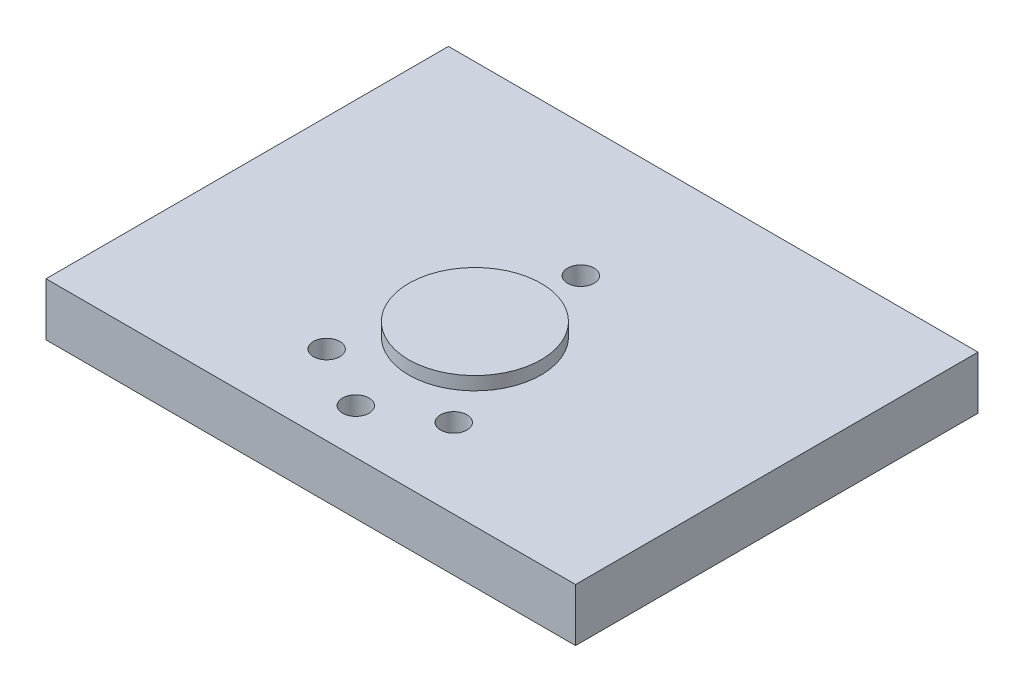
ISO-10303-21;
HEADER;
FILE_DESCRIPTION(('STEP AP214'),'2;1');
FILE_NAME('part.step','',(''),(''),'','','');
FILE_SCHEMA(('AUTOMOTIVE_DESIGN { 1 0 10303 214 1 1 1 1 }'));
ENDSEC;
DATA;
#1=APPLICATION_CONTEXT('core data for automotive mechanical design processes');
#2=APPLICATION_PROTOCOL_DEFINITION('international standard','automotive_design',2000,#1);
#3=PRODUCT_CONTEXT('',#1,'mechanical');
#4=PRODUCT('Part','Part','',(#3));
#5=PRODUCT_RELATED_PRODUCT_CATEGORY('part','',(#4));
#6=PRODUCT_DEFINITION_FORMATION('','',#4);
#7=PRODUCT_DEFINITION_CONTEXT('part definition',#1,'design');
#8=PRODUCT_DEFINITION('design','',#6,#7);
#9=PRODUCT_DEFINITION_SHAPE('','',#8);
#10=(LENGTH_UNIT() NAMED_UNIT(*) SI_UNIT(.MILLI.,.METRE.));
#11=(NAMED_UNIT(*) PLANE_ANGLE_UNIT() SI_UNIT($,.RADIAN.));
#12=(NAMED_UNIT(*) SI_UNIT($,.STERADIAN.) SOLID_ANGLE_UNIT());
#13=UNCERTAINTY_MEASURE_WITH_UNIT(LENGTH_MEASURE(1.E-05),#10,'distance_accuracy_value','');
#14=(GEOMETRIC_REPRESENTATION_CONTEXT(3) GLOBAL_UNCERTAINTY_ASSIGNED_CONTEXT((#13)) GLOBAL_UNIT_ASSIGNED_CONTEXT((#10,
#11,#12)) REPRESENTATION_CONTEXT('',''));
#15=CARTESIAN_POINT('',(0.,0.,0.));
#16=DIRECTION('',(0.,0.,1.));
#17=DIRECTION('',(1.,0.,0.));
#18=AXIS2_PLACEMENT_3D('',#15,#16,#17);
#19=CARTESIAN_POINT('',(63.5,15.875,-48.26));
#20=DIRECTION('',(-1.,0.,0.));
#21=DIRECTION('',(0.,0.,1.));
#22=AXIS2_PLACEMENT_3D('',#19,#20,#21);
#23=PLANE('',#22);
#24=DIRECTION('',(0.,0.,-1.));
#25=VECTOR('',#24,1.);
#26=CARTESIAN_POINT('',(63.5,12.7,48.26));
#27=LINE('',#26,#25);
#28=CARTESIAN_POINT('',(63.5,12.7,48.26));
#29=VERTEX_POINT('',#28);
#30=CARTESIAN_POINT('',(63.5,12.7,-48.26));
#31=VERTEX_POINT('',#30);
#32=EDGE_CURVE('E73',#29,#31,#27,.T.);
#33=ORIENTED_EDGE('',*,*,#32,.F.);
#34=DIRECTION('',(0.,-1.,0.));
#35=VECTOR('',#34,1.);
#36=CARTESIAN_POINT('',(63.5,15.875,48.26));
#37=LINE('',#36,#35);
#38=CARTESIAN_POINT('',(63.5,0.,48.26));
#39=VERTEX_POINT('',#38);
#40=EDGE_CURVE('E55',#29,#39,#37,.T.);
#41=ORIENTED_EDGE('',*,*,#40,.T.);
#42=DIRECTION('',(0.,0.,-1.));
#43=VECTOR('',#42,1.);
#44=CARTESIAN_POINT('',(63.5,0.,-48.26));
#45=LINE('',#44,#43);
#46=CARTESIAN_POINT('',(63.5,0.,-48.26));
#47=VERTEX_POINT('',#46);
#48=EDGE_CURVE('E103',#39,#47,#45,.T.);
#49=ORIENTED_EDGE('',*,*,#48,.T.);
#50=DIRECTION('',(0.,-1.,0.));
#51=VECTOR('',#50,1.);
#52=CARTESIAN_POINT('',(63.5,15.875,-48.26));
#53=LINE('',#52,#51);
#54=EDGE_CURVE('E11',#31,#47,#53,.T.);
#55=ORIENTED_EDGE('',*,*,#54,.F.);
#56=EDGE_LOOP('',(#33,#41,#49,#55));
#57=FACE_BOUND('',#56,.T.);
#58=ADVANCED_FACE('F33',(#57),#23,.F.);
#59=CARTESIAN_POINT('',(-63.5,15.875,-48.26));
#60=DIRECTION('',(0.,0.,1.));
#61=DIRECTION('',(1.,0.,0.));
#62=AXIS2_PLACEMENT_3D('',#59,#60,#61);
#63=PLANE('',#62);
#64=DIRECTION('',(-1.,0.,0.));
#65=VECTOR('',#64,1.);
#66=CARTESIAN_POINT('',(63.5,12.7,-48.26));
#67=LINE('',#66,#65);
#68=CARTESIAN_POINT('',(-63.5,12.7,-48.26));
#69=VERTEX_POINT('',#68);
#70=EDGE_CURVE('E80',#31,#69,#67,.T.);
#71=ORIENTED_EDGE('',*,*,#70,.F.);
#72=ORIENTED_EDGE('',*,*,#54,.T.);
#73=DIRECTION('',(-1.,0.,0.));
#74=VECTOR('',#73,1.);
#75=CARTESIAN_POINT('',(-63.5,0.,-48.26));
#76=LINE('',#75,#74);
#77=CARTESIAN_POINT('',(-63.5,0.,-48.26));
#78=VERTEX_POINT('',#77);
#79=EDGE_CURVE('E100',#47,#78,#76,.T.);
#80=ORIENTED_EDGE('',*,*,#79,.T.);
#81=DIRECTION('',(0.,-1.,0.));
#82=VECTOR('',#81,1.);
#83=CARTESIAN_POINT('',(-63.5,15.875,-48.26));
#84=LINE('',#83,#82);
#85=EDGE_CURVE('E40',#69,#78,#84,.T.);
#86=ORIENTED_EDGE('',*,*,#85,.F.);
#87=EDGE_LOOP('',(#71,#72,#80,#86));
#88=FACE_BOUND('',#87,.T.);
#89=ADVANCED_FACE('F101',(#88),#63,.F.);
#90=CARTESIAN_POINT('',(-63.5,15.875,-48.26));
#91=DIRECTION('',(1.,0.,0.));
#92=DIRECTION('',(0.,0.,-1.));
#93=AXIS2_PLACEMENT_3D('',#90,#91,#92);
#94=PLANE('',#93);
#95=DIRECTION('',(0.,0.,1.));
#96=VECTOR('',#95,1.);
#97=CARTESIAN_POINT('',(-63.5,12.7,-48.26));
#98=LINE('',#97,#96);
#99=CARTESIAN_POINT('',(-63.5,12.7,48.26));
#100=VERTEX_POINT('',#99);
#101=EDGE_CURVE('E47',#69,#100,#98,.T.);
#102=ORIENTED_EDGE('',*,*,#101,.F.);
#103=ORIENTED_EDGE('',*,*,#85,.T.);
#104=DIRECTION('',(0.,0.,1.));
#105=VECTOR('',#104,1.);
#106=CARTESIAN_POINT('',(-63.5,0.,-48.26));
#107=LINE('',#106,#105);
#108=CARTESIAN_POINT('',(-63.5,0.,48.26));
#109=VERTEX_POINT('',#108);
#110=EDGE_CURVE('E89',#78,#109,#107,.T.);
#111=ORIENTED_EDGE('',*,*,#110,.T.);
#112=DIRECTION('',(0.,-1.,0.));
#113=VECTOR('',#112,1.);
#114=CARTESIAN_POINT('',(-63.5,15.875,48.26));
#115=LINE('',#114,#113);
#116=EDGE_CURVE('E86',#100,#109,#115,.T.);
#117=ORIENTED_EDGE('',*,*,#116,.F.);
#118=EDGE_LOOP('',(#102,#103,#111,#117));
#119=FACE_BOUND('',#118,.T.);
#120=ADVANCED_FACE('F96',(#119),#94,.F.);
#121=CARTESIAN_POINT('',(-63.5,15.875,48.26));
#122=DIRECTION('',(0.,0.,-1.));
#123=DIRECTION('',(-1.,0.,0.));
#124=AXIS2_PLACEMENT_3D('',#121,#122,#123);
#125=PLANE('',#124);
#126=DIRECTION('',(1.,0.,0.));
#127=VECTOR('',#126,1.);
#128=CARTESIAN_POINT('',(-63.5,12.7,48.26));
#129=LINE('',#128,#127);
#130=EDGE_CURVE('E71',#100,#29,#129,.T.);
#131=ORIENTED_EDGE('',*,*,#130,.F.);
#132=ORIENTED_EDGE('',*,*,#116,.T.);
#133=DIRECTION('',(1.,0.,0.));
#134=VECTOR('',#133,1.);
#135=CARTESIAN_POINT('',(-63.5,0.,48.26));
#136=LINE('',#135,#134);
#137=EDGE_CURVE('E84',#109,#39,#136,.T.);
#138=ORIENTED_EDGE('',*,*,#137,.T.);
#139=ORIENTED_EDGE('',*,*,#40,.F.);
#140=EDGE_LOOP('',(#131,#132,#138,#139));
#141=FACE_BOUND('',#140,.T.);
#142=ADVANCED_FACE('F82',(#141),#125,.F.);
#143=CARTESIAN_POINT('',(0.,0.,0.));
#144=DIRECTION('',(0.,1.,0.));
#145=DIRECTION('',(0.,0.,1.));
#146=AXIS2_PLACEMENT_3D('',#143,#144,#145);
#147=PLANE('',#146);
#148=CARTESIAN_POINT('',(15.24,0.,29.21));
#149=DIRECTION('',(0.,1.,0.));
#150=DIRECTION('',(0.,0.,1.));
#151=AXIS2_PLACEMENT_3D('',#148,#149,#150);
#152=CIRCLE('',#151,3.17499999999999);
#153=CARTESIAN_POINT('',(15.24,0.,32.385));
#154=VERTEX_POINT('',#153);
#155=EDGE_CURVE('E133',#154,#154,#152,.T.);
#156=ORIENTED_EDGE('',*,*,#155,.T.);
#157=EDGE_LOOP('',(#156));
#158=FACE_BOUND('',#157,.T.);
#159=CARTESIAN_POINT('',(-2.35922392732846E-13,0.,37.4649999999999));
#160=DIRECTION('',(0.,1.,0.));
#161=DIRECTION('',(0.,0.,1.));
#162=AXIS2_PLACEMENT_3D('',#159,#160,#161);
#163=CIRCLE('',#162,3.17499999999999);
#164=CARTESIAN_POINT('',(-2.35922392732846E-13,0.,40.6399999999999));
#165=VERTEX_POINT('',#164);
#166=EDGE_CURVE('E127',#165,#165,#163,.T.);
#167=ORIENTED_EDGE('',*,*,#166,.T.);
#168=EDGE_LOOP('',(#167));
#169=FACE_BOUND('',#168,.T.);
#170=CARTESIAN_POINT('',(0.,0.,-16.51));
#171=DIRECTION('',(0.,1.,0.));
#172=DIRECTION('',(0.,0.,1.));
#173=AXIS2_PLACEMENT_3D('',#170,#171,#172);
#174=CIRCLE('',#173,3.17499999999999);
#175=CARTESIAN_POINT('',(0.,0.,-13.335));
#176=VERTEX_POINT('',#175);
#177=EDGE_CURVE('E121',#176,#176,#174,.T.);
#178=ORIENTED_EDGE('',*,*,#177,.T.);
#179=EDGE_LOOP('',(#178));
#180=FACE_BOUND('',#179,.T.);
#181=CARTESIAN_POINT('',(-15.24,0.,29.21));
#182=DIRECTION('',(0.,1.,0.));
#183=DIRECTION('',(0.,0.,1.));
#184=AXIS2_PLACEMENT_3D('',#181,#182,#183);
#185=CIRCLE('',#184,3.17499999999999);
#186=CARTESIAN_POINT('',(-15.24,0.,32.385));
#187=VERTEX_POINT('',#186);
#188=EDGE_CURVE('E113',#187,#187,#185,.T.);
#189=ORIENTED_EDGE('',*,*,#188,.T.);
#190=EDGE_LOOP('',(#189));
#191=FACE_BOUND('',#190,.T.);
#192=ORIENTED_EDGE('',*,*,#48,.F.);
#193=ORIENTED_EDGE('',*,*,#137,.F.);
#194=ORIENTED_EDGE('',*,*,#110,.F.);
#195=ORIENTED_EDGE('',*,*,#79,.F.);
#196=EDGE_LOOP('',(#192,#193,#194,#195));
#197=FACE_BOUND('',#196,.T.);
#198=ADVANCED_FACE('F105',(#158,#169,#180,#191,#197),#147,.F.);
#199=CARTESIAN_POINT('',(0.,12.7,0.));
#200=DIRECTION('',(0.,1.,0.));
#201=DIRECTION('',(0.,0.,1.));
#202=AXIS2_PLACEMENT_3D('',#199,#200,#201);
#203=PLANE('',#202);
#204=CARTESIAN_POINT('',(15.24,12.7,29.21));
#205=DIRECTION('',(0.,1.,0.));
#206=DIRECTION('',(0.,0.,1.));
#207=AXIS2_PLACEMENT_3D('',#204,#205,#206);
#208=CIRCLE('',#207,3.17499999999999);
#209=CARTESIAN_POINT('',(15.24,12.7,32.385));
#210=VERTEX_POINT('',#209);
#211=EDGE_CURVE('E136',#210,#210,#208,.T.);
#212=ORIENTED_EDGE('',*,*,#211,.F.);
#213=EDGE_LOOP('',(#212));
#214=FACE_BOUND('',#213,.T.);
#215=CARTESIAN_POINT('',(-2.35922392732846E-13,12.7,37.4649999999999));
#216=DIRECTION('',(0.,1.,0.));
#217=DIRECTION('',(0.,0.,1.));
#218=AXIS2_PLACEMENT_3D('',#215,#216,#217);
#219=CIRCLE('',#218,3.17499999999999);
#220=CARTESIAN_POINT('',(-2.35922392732846E-13,12.7,40.6399999999999));
#221=VERTEX_POINT('',#220);
#222=EDGE_CURVE('E130',#221,#221,#219,.T.);
#223=ORIENTED_EDGE('',*,*,#222,.F.);
#224=EDGE_LOOP('',(#223));
#225=FACE_BOUND('',#224,.T.);
#226=CARTESIAN_POINT('',(0.,12.7,-16.51));
#227=DIRECTION('',(0.,1.,0.));
#228=DIRECTION('',(0.,0.,1.));
#229=AXIS2_PLACEMENT_3D('',#226,#227,#228);
#230=CIRCLE('',#229,3.17499999999999);
#231=CARTESIAN_POINT('',(0.,12.7,-13.335));
#232=VERTEX_POINT('',#231);
#233=EDGE_CURVE('E124',#232,#232,#230,.T.);
#234=ORIENTED_EDGE('',*,*,#233,.F.);
#235=EDGE_LOOP('',(#234));
#236=FACE_BOUND('',#235,.T.);
#237=CARTESIAN_POINT('',(-15.24,12.7,29.21));
#238=DIRECTION('',(0.,1.,0.));
#239=DIRECTION('',(0.,0.,1.));
#240=AXIS2_PLACEMENT_3D('',#237,#238,#239);
#241=CIRCLE('',#240,3.17499999999999);
#242=CARTESIAN_POINT('',(-15.24,12.7,32.385));
#243=VERTEX_POINT('',#242);
#244=EDGE_CURVE('E118',#243,#243,#241,.T.);
#245=ORIENTED_EDGE('',*,*,#244,.F.);
#246=EDGE_LOOP('',(#245));
#247=FACE_BOUND('',#246,.T.);
#248=CARTESIAN_POINT('',(0.,12.7,8.89000000000001));
#249=DIRECTION('',(0.,1.,0.));
#250=DIRECTION('',(0.,0.,1.));
#251=AXIS2_PLACEMENT_3D('',#248,#249,#250);
#252=CIRCLE('',#251,15.875);
#253=CARTESIAN_POINT('',(0.,12.7,24.765));
#254=VERTEX_POINT('',#253);
#255=EDGE_CURVE('E77',#254,#254,#252,.T.);
#256=ORIENTED_EDGE('',*,*,#255,.F.);
#257=EDGE_LOOP('',(#256));
#258=FACE_BOUND('',#257,.T.);
#259=ORIENTED_EDGE('',*,*,#130,.T.);
#260=ORIENTED_EDGE('',*,*,#32,.T.);
#261=ORIENTED_EDGE('',*,*,#70,.T.);
#262=ORIENTED_EDGE('',*,*,#101,.T.);
#263=EDGE_LOOP('',(#259,#260,#261,#262));
#264=FACE_BOUND('',#263,.T.);
#265=ADVANCED_FACE('F72',(#214,#225,#236,#247,#258,#264),#203,.T.);
#266=CARTESIAN_POINT('',(0.,12.7,8.89000000000001));
#267=DIRECTION('',(0.,1.,0.));
#268=DIRECTION('',(0.,0.,1.));
#269=AXIS2_PLACEMENT_3D('',#266,#267,#268);
#270=CYLINDRICAL_SURFACE('',#269,15.875);
#271=ORIENTED_EDGE('',*,*,#255,.T.);
#272=EDGE_LOOP('',(#271));
#273=FACE_BOUND('',#272,.T.);
#274=CARTESIAN_POINT('',(0.,15.875,8.89000000000001));
#275=DIRECTION('',(0.,1.,0.));
#276=DIRECTION('',(0.,0.,1.));
#277=AXIS2_PLACEMENT_3D('',#274,#275,#276);
#278=CIRCLE('',#277,15.875);
#279=CARTESIAN_POINT('',(0.,15.875,24.765));
#280=VERTEX_POINT('',#279);
#281=EDGE_CURVE('E110',#280,#280,#278,.T.);
#282=ORIENTED_EDGE('',*,*,#281,.F.);
#283=EDGE_LOOP('',(#282));
#284=FACE_BOUND('',#283,.T.);
#285=ADVANCED_FACE('F144',(#273,#284),#270,.T.);
#286=CARTESIAN_POINT('',(0.,15.875,0.));
#287=DIRECTION('',(0.,1.,0.));
#288=DIRECTION('',(0.,0.,1.));
#289=AXIS2_PLACEMENT_3D('',#286,#287,#288);
#290=PLANE('',#289);
#291=ORIENTED_EDGE('',*,*,#281,.T.);
#292=EDGE_LOOP('',(#291));
#293=FACE_BOUND('',#292,.T.);
#294=ADVANCED_FACE('F156',(#293),#290,.T.);
#295=CARTESIAN_POINT('',(-15.24,12.7,29.21));
#296=DIRECTION('',(0.,1.,0.));
#297=DIRECTION('',(0.,0.,1.));
#298=AXIS2_PLACEMENT_3D('',#295,#296,#297);
#299=CYLINDRICAL_SURFACE('',#298,3.17499999999999);
#300=ORIENTED_EDGE('',*,*,#188,.F.);
#301=EDGE_LOOP('',(#300));
#302=FACE_BOUND('',#301,.T.);
#303=ORIENTED_EDGE('',*,*,#244,.T.);
#304=EDGE_LOOP('',(#303));
#305=FACE_BOUND('',#304,.T.);
#306=ADVANCED_FACE('F161',(#302,#305),#299,.F.);
#307=CARTESIAN_POINT('',(0.,12.7,-16.51));
#308=DIRECTION('',(0.,1.,0.));
#309=DIRECTION('',(0.,0.,1.));
#310=AXIS2_PLACEMENT_3D('',#307,#308,#309);
#311=CYLINDRICAL_SURFACE('',#310,3.17499999999999);
#312=ORIENTED_EDGE('',*,*,#177,.F.);
#313=EDGE_LOOP('',(#312));
#314=FACE_BOUND('',#313,.T.);
#315=ORIENTED_EDGE('',*,*,#233,.T.);
#316=EDGE_LOOP('',(#315));
#317=FACE_BOUND('',#316,.T.);
#318=ADVANCED_FACE('F166',(#314,#317),#311,.F.);
#319=CARTESIAN_POINT('',(-2.35922392732846E-13,12.7,37.4649999999999));
#320=DIRECTION('',(0.,1.,0.));
#321=DIRECTION('',(0.,0.,1.));
#322=AXIS2_PLACEMENT_3D('',#319,#320,#321);
#323=CYLINDRICAL_SURFACE('',#322,3.17499999999999);
#324=ORIENTED_EDGE('',*,*,#166,.F.);
#325=EDGE_LOOP('',(#324));
#326=FACE_BOUND('',#325,.T.);
#327=ORIENTED_EDGE('',*,*,#222,.T.);
#328=EDGE_LOOP('',(#327));
#329=FACE_BOUND('',#328,.T.);
#330=ADVANCED_FACE('F195',(#326,#329),#323,.F.);
#331=CARTESIAN_POINT('',(15.24,12.7,29.21));
#332=DIRECTION('',(0.,1.,0.));
#333=DIRECTION('',(0.,0.,1.));
#334=AXIS2_PLACEMENT_3D('',#331,#332,#333);
#335=CYLINDRICAL_SURFACE('',#334,3.17499999999999);
#336=ORIENTED_EDGE('',*,*,#155,.F.);
#337=EDGE_LOOP('',(#336));
#338=FACE_BOUND('',#337,.T.);
#339=ORIENTED_EDGE('',*,*,#211,.T.);
#340=EDGE_LOOP('',(#339));
#341=FACE_BOUND('',#340,.T.);
#342=ADVANCED_FACE('F140',(#338,#341),#335,.F.);
#343=CLOSED_SHELL('',(#58,#89,#120,#142,#198,#265,#285,#294,#306,#318,#330,#342));
#344=MANIFOLD_SOLID_BREP('B2',#343);
#345=ADVANCED_BREP_SHAPE_REPRESENTATION('',(#18,#344),#14);
#346=SHAPE_DEFINITION_REPRESENTATION(#9,#345);
ENDSEC;
END-ISO-10303-21;
